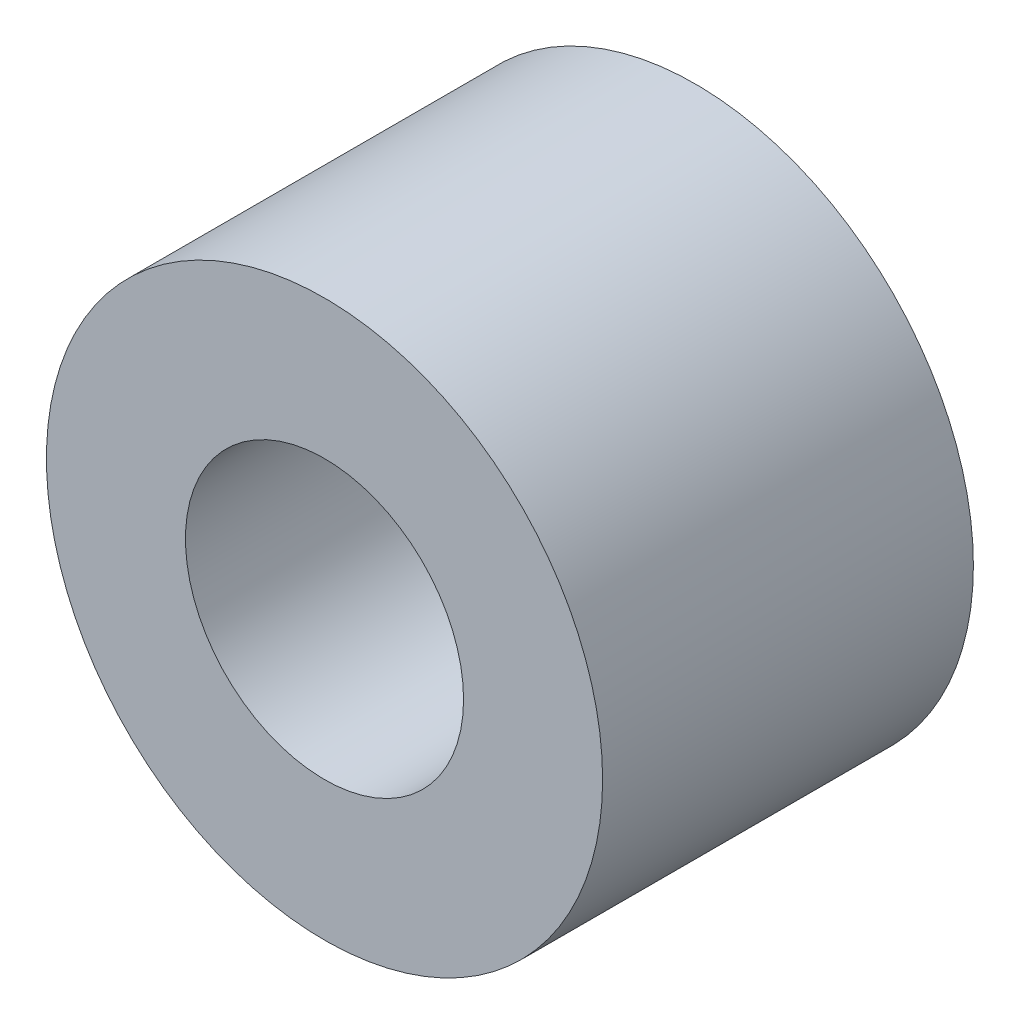
ISO-10303-21;
HEADER;
FILE_DESCRIPTION(('STEP AP214'),'2;1');
FILE_NAME('part.step','',(''),(''),'','','');
FILE_SCHEMA(('AUTOMOTIVE_DESIGN { 1 0 10303 214 1 1 1 1 }'));
ENDSEC;
DATA;
#1=APPLICATION_CONTEXT('core data for automotive mechanical design processes');
#2=APPLICATION_PROTOCOL_DEFINITION('international standard','automotive_design',2000,#1);
#3=PRODUCT_CONTEXT('',#1,'mechanical');
#4=PRODUCT('Part','Part','',(#3));
#5=PRODUCT_RELATED_PRODUCT_CATEGORY('part','',(#4));
#6=PRODUCT_DEFINITION_FORMATION('','',#4);
#7=PRODUCT_DEFINITION_CONTEXT('part definition',#1,'design');
#8=PRODUCT_DEFINITION('design','',#6,#7);
#9=PRODUCT_DEFINITION_SHAPE('','',#8);
#10=(LENGTH_UNIT() NAMED_UNIT(*) SI_UNIT(.MILLI.,.METRE.));
#11=(NAMED_UNIT(*) PLANE_ANGLE_UNIT() SI_UNIT($,.RADIAN.));
#12=(NAMED_UNIT(*) SI_UNIT($,.STERADIAN.) SOLID_ANGLE_UNIT());
#13=UNCERTAINTY_MEASURE_WITH_UNIT(LENGTH_MEASURE(1.E-05),#10,'distance_accuracy_value','');
#14=(GEOMETRIC_REPRESENTATION_CONTEXT(3) GLOBAL_UNCERTAINTY_ASSIGNED_CONTEXT((#13)) GLOBAL_UNIT_ASSIGNED_CONTEXT((#10,
#11,#12)) REPRESENTATION_CONTEXT('',''));
#15=CARTESIAN_POINT('',(0.,0.,0.));
#16=DIRECTION('',(0.,0.,1.));
#17=DIRECTION('',(1.,0.,0.));
#18=AXIS2_PLACEMENT_3D('',#15,#16,#17);
#19=CARTESIAN_POINT('',(-12.4999999999997,-45.6638723622189,-4.));
#20=DIRECTION('',(0.,0.,1.));
#21=DIRECTION('',(1.,0.,0.));
#22=AXIS2_PLACEMENT_3D('',#19,#20,#21);
#23=CYLINDRICAL_SURFACE('',#22,3.);
#24=CARTESIAN_POINT('',(-12.4999999999997,-45.6638723622189,-4.));
#25=DIRECTION('',(0.,0.,1.));
#26=DIRECTION('',(1.,0.,0.));
#27=AXIS2_PLACEMENT_3D('',#24,#25,#26);
#28=CIRCLE('',#27,3.);
#29=CARTESIAN_POINT('',(-9.49999999999973,-45.6638723622189,-4.));
#30=VERTEX_POINT('',#29);
#31=EDGE_CURVE('E10',#30,#30,#28,.T.);
#32=ORIENTED_EDGE('',*,*,#31,.T.);
#33=EDGE_LOOP('',(#32));
#34=FACE_BOUND('',#33,.T.);
#35=CARTESIAN_POINT('',(-12.4999999999997,-45.6638723622189,0.));
#36=DIRECTION('',(0.,0.,1.));
#37=DIRECTION('',(1.,0.,0.));
#38=AXIS2_PLACEMENT_3D('',#35,#36,#37);
#39=CIRCLE('',#38,3.);
#40=CARTESIAN_POINT('',(-9.49999999999973,-45.6638723622189,0.));
#41=VERTEX_POINT('',#40);
#42=EDGE_CURVE('E33',#41,#41,#39,.T.);
#43=ORIENTED_EDGE('',*,*,#42,.F.);
#44=EDGE_LOOP('',(#43));
#45=FACE_BOUND('',#44,.T.);
#46=ADVANCED_FACE('F30',(#34,#45),#23,.T.);
#47=CARTESIAN_POINT('',(-12.4999999999997,-45.6638723622189,-4.));
#48=DIRECTION('',(0.,0.,1.));
#49=DIRECTION('',(1.,0.,0.));
#50=AXIS2_PLACEMENT_3D('',#47,#48,#49);
#51=PLANE('',#50);
#52=CARTESIAN_POINT('',(-12.4999999999997,-45.6638723622189,-4.));
#53=DIRECTION('',(0.,0.,1.));
#54=DIRECTION('',(1.,0.,0.));
#55=AXIS2_PLACEMENT_3D('',#52,#53,#54);
#56=CIRCLE('',#55,1.5);
#57=CARTESIAN_POINT('',(-10.9999999999997,-45.6638723622189,-4.));
#58=VERTEX_POINT('',#57);
#59=EDGE_CURVE('E40',#58,#58,#56,.T.);
#60=ORIENTED_EDGE('',*,*,#59,.T.);
#61=EDGE_LOOP('',(#60));
#62=FACE_BOUND('',#61,.T.);
#63=ORIENTED_EDGE('',*,*,#31,.F.);
#64=EDGE_LOOP('',(#63));
#65=FACE_BOUND('',#64,.T.);
#66=ADVANCED_FACE('F48',(#62,#65),#51,.F.);
#67=CARTESIAN_POINT('',(-12.4999999999997,-45.6638723622189,0.));
#68=DIRECTION('',(0.,0.,1.));
#69=DIRECTION('',(1.,0.,0.));
#70=AXIS2_PLACEMENT_3D('',#67,#68,#69);
#71=PLANE('',#70);
#72=CARTESIAN_POINT('',(-12.4999999999997,-45.6638723622189,0.));
#73=DIRECTION('',(0.,0.,1.));
#74=DIRECTION('',(1.,0.,0.));
#75=AXIS2_PLACEMENT_3D('',#72,#73,#74);
#76=CIRCLE('',#75,1.5);
#77=CARTESIAN_POINT('',(-10.9999999999997,-45.6638723622189,0.));
#78=VERTEX_POINT('',#77);
#79=EDGE_CURVE('E42',#78,#78,#76,.T.);
#80=ORIENTED_EDGE('',*,*,#79,.F.);
#81=EDGE_LOOP('',(#80));
#82=FACE_BOUND('',#81,.T.);
#83=ORIENTED_EDGE('',*,*,#42,.T.);
#84=EDGE_LOOP('',(#83));
#85=FACE_BOUND('',#84,.T.);
#86=ADVANCED_FACE('F54',(#82,#85),#71,.T.);
#87=CARTESIAN_POINT('',(-12.4999999999997,-45.6638723622189,-4.));
#88=DIRECTION('',(0.,0.,1.));
#89=DIRECTION('',(1.,0.,0.));
#90=AXIS2_PLACEMENT_3D('',#87,#88,#89);
#91=CYLINDRICAL_SURFACE('',#90,1.5);
#92=ORIENTED_EDGE('',*,*,#59,.F.);
#93=EDGE_LOOP('',(#92));
#94=FACE_BOUND('',#93,.T.);
#95=ORIENTED_EDGE('',*,*,#79,.T.);
#96=EDGE_LOOP('',(#95));
#97=FACE_BOUND('',#96,.T.);
#98=ADVANCED_FACE('F51',(#94,#97),#91,.F.);
#99=CLOSED_SHELL('',(#46,#66,#86,#98));
#100=MANIFOLD_SOLID_BREP('B2',#99);
#101=ADVANCED_BREP_SHAPE_REPRESENTATION('',(#18,#100),#14);
#102=SHAPE_DEFINITION_REPRESENTATION(#9,#101);
ENDSEC;
END-ISO-10303-21;
